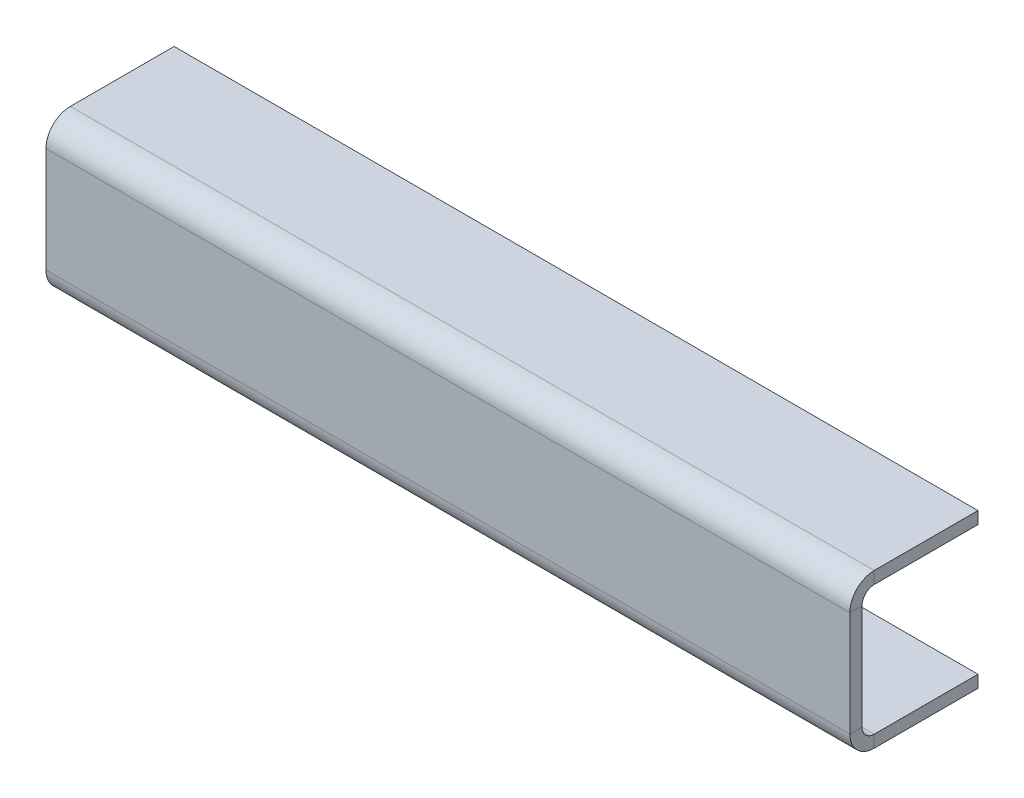
ISO-10303-21;
HEADER;
FILE_DESCRIPTION(('STEP AP214'),'2;1');
FILE_NAME('part.step','',(''),(''),'','','');
FILE_SCHEMA(('AUTOMOTIVE_DESIGN { 1 0 10303 214 1 1 1 1 }'));
ENDSEC;
DATA;
#1=APPLICATION_CONTEXT('core data for automotive mechanical design processes');
#2=APPLICATION_PROTOCOL_DEFINITION('international standard','automotive_design',2000,#1);
#3=PRODUCT_CONTEXT('',#1,'mechanical');
#4=PRODUCT('Part','Part','',(#3));
#5=PRODUCT_RELATED_PRODUCT_CATEGORY('part','',(#4));
#6=PRODUCT_DEFINITION_FORMATION('','',#4);
#7=PRODUCT_DEFINITION_CONTEXT('part definition',#1,'design');
#8=PRODUCT_DEFINITION('design','',#6,#7);
#9=PRODUCT_DEFINITION_SHAPE('','',#8);
#10=(LENGTH_UNIT() NAMED_UNIT(*) SI_UNIT(.MILLI.,.METRE.));
#11=(NAMED_UNIT(*) PLANE_ANGLE_UNIT() SI_UNIT($,.RADIAN.));
#12=(NAMED_UNIT(*) SI_UNIT($,.STERADIAN.) SOLID_ANGLE_UNIT());
#13=UNCERTAINTY_MEASURE_WITH_UNIT(LENGTH_MEASURE(1.E-05),#10,'distance_accuracy_value','');
#14=(GEOMETRIC_REPRESENTATION_CONTEXT(3) GLOBAL_UNCERTAINTY_ASSIGNED_CONTEXT((#13)) GLOBAL_UNIT_ASSIGNED_CONTEXT((#10,
#11,#12)) REPRESENTATION_CONTEXT('',''));
#15=CARTESIAN_POINT('',(0.,0.,0.));
#16=DIRECTION('',(0.,0.,1.));
#17=DIRECTION('',(1.,0.,0.));
#18=AXIS2_PLACEMENT_3D('',#15,#16,#17);
#19=CARTESIAN_POINT('',(209.55,0.,-3.175));
#20=DIRECTION('',(1.,0.,0.));
#21=DIRECTION('',(0.,0.,-1.));
#22=AXIS2_PLACEMENT_3D('',#19,#20,#21);
#23=PLANE('',#22);
#24=DIRECTION('',(0.,-1.,0.));
#25=VECTOR('',#24,1.);
#26=CARTESIAN_POINT('',(209.55,0.,-3.175));
#27=LINE('',#26,#25);
#28=CARTESIAN_POINT('',(209.55,0.,-3.175));
#29=VERTEX_POINT('',#28);
#30=CARTESIAN_POINT('',(209.55,-3.175,-3.175));
#31=VERTEX_POINT('',#30);
#32=EDGE_CURVE('E11',#29,#31,#27,.T.);
#33=ORIENTED_EDGE('',*,*,#32,.F.);
#34=CARTESIAN_POINT('',(209.55,3.175,-3.175));
#35=DIRECTION('',(1.,0.,0.));
#36=DIRECTION('',(0.,0.,-1.));
#37=AXIS2_PLACEMENT_3D('',#34,#35,#36);
#38=CIRCLE('',#37,3.175);
#39=CARTESIAN_POINT('',(209.55,3.175,0.));
#40=VERTEX_POINT('',#39);
#41=EDGE_CURVE('E145',#29,#40,#38,.F.);
#42=ORIENTED_EDGE('',*,*,#41,.T.);
#43=DIRECTION('',(0.,0.,-1.));
#44=VECTOR('',#43,1.);
#45=CARTESIAN_POINT('',(209.55,3.175,3.175));
#46=LINE('',#45,#44);
#47=CARTESIAN_POINT('',(209.55,3.175,3.175));
#48=VERTEX_POINT('',#47);
#49=EDGE_CURVE('E43',#48,#40,#46,.T.);
#50=ORIENTED_EDGE('',*,*,#49,.F.);
#51=CARTESIAN_POINT('',(209.55,3.175,-3.175));
#52=DIRECTION('',(1.,0.,0.));
#53=DIRECTION('',(0.,0.,-1.));
#54=AXIS2_PLACEMENT_3D('',#51,#52,#53);
#55=CIRCLE('',#54,6.35);
#56=EDGE_CURVE('E239',#31,#48,#55,.F.);
#57=ORIENTED_EDGE('',*,*,#56,.F.);
#58=EDGE_LOOP('',(#33,#42,#50,#57));
#59=FACE_BOUND('',#58,.T.);
#60=ADVANCED_FACE('F35',(#59),#23,.T.);
#61=CARTESIAN_POINT('',(209.55,3.175,3.175));
#62=DIRECTION('',(1.,0.,0.));
#63=DIRECTION('',(0.,0.,-1.));
#64=AXIS2_PLACEMENT_3D('',#61,#62,#63);
#65=PLANE('',#64);
#66=DIRECTION('',(0.,0.,1.));
#67=VECTOR('',#66,1.);
#68=CARTESIAN_POINT('',(209.55,0.,0.));
#69=LINE('',#68,#67);
#70=CARTESIAN_POINT('',(209.55,0.,-30.226));
#71=VERTEX_POINT('',#70);
#72=EDGE_CURVE('E150',#71,#29,#69,.T.);
#73=ORIENTED_EDGE('',*,*,#72,.T.);
#74=ORIENTED_EDGE('',*,*,#32,.T.);
#75=DIRECTION('',(0.,0.,-1.));
#76=VECTOR('',#75,1.);
#77=CARTESIAN_POINT('',(209.55,-3.175,0.));
#78=LINE('',#77,#76);
#79=CARTESIAN_POINT('',(209.55,-3.175,-30.226));
#80=VERTEX_POINT('',#79);
#81=EDGE_CURVE('E252',#80,#31,#78,.F.);
#82=ORIENTED_EDGE('',*,*,#81,.F.);
#83=DIRECTION('',(0.,-1.,0.));
#84=VECTOR('',#83,1.);
#85=CARTESIAN_POINT('',(209.55,0.,-30.226));
#86=LINE('',#85,#84);
#87=EDGE_CURVE('E254',#71,#80,#86,.T.);
#88=ORIENTED_EDGE('',*,*,#87,.F.);
#89=EDGE_LOOP('',(#73,#74,#82,#88));
#90=FACE_BOUND('',#89,.T.);
#91=ADVANCED_FACE('F265',(#90),#65,.T.);
#92=CARTESIAN_POINT('',(0.,3.175,0.));
#93=DIRECTION('',(-1.,0.,0.));
#94=DIRECTION('',(0.,0.,1.));
#95=AXIS2_PLACEMENT_3D('',#92,#93,#94);
#96=PLANE('',#95);
#97=DIRECTION('',(0.,0.,1.));
#98=VECTOR('',#97,1.);
#99=CARTESIAN_POINT('',(0.,3.175,0.));
#100=LINE('',#99,#98);
#101=CARTESIAN_POINT('',(0.,3.175,0.));
#102=VERTEX_POINT('',#101);
#103=CARTESIAN_POINT('',(0.,3.175,3.175));
#104=VERTEX_POINT('',#103);
#105=EDGE_CURVE('E143',#102,#104,#100,.T.);
#106=ORIENTED_EDGE('',*,*,#105,.F.);
#107=CARTESIAN_POINT('',(0.,3.175,-3.175));
#108=DIRECTION('',(1.,0.,0.));
#109=DIRECTION('',(0.,0.,-1.));
#110=AXIS2_PLACEMENT_3D('',#107,#108,#109);
#111=CIRCLE('',#110,3.175);
#112=CARTESIAN_POINT('',(0.,0.,-3.175));
#113=VERTEX_POINT('',#112);
#114=EDGE_CURVE('E157',#113,#102,#111,.F.);
#115=ORIENTED_EDGE('',*,*,#114,.F.);
#116=DIRECTION('',(0.,1.,0.));
#117=VECTOR('',#116,1.);
#118=CARTESIAN_POINT('',(0.,-3.175,-3.175));
#119=LINE('',#118,#117);
#120=CARTESIAN_POINT('',(0.,-3.175,-3.175));
#121=VERTEX_POINT('',#120);
#122=EDGE_CURVE('E230',#121,#113,#119,.T.);
#123=ORIENTED_EDGE('',*,*,#122,.F.);
#124=CARTESIAN_POINT('',(0.,3.175,-3.175));
#125=DIRECTION('',(1.,0.,0.));
#126=DIRECTION('',(0.,0.,-1.));
#127=AXIS2_PLACEMENT_3D('',#124,#125,#126);
#128=CIRCLE('',#127,6.35);
#129=EDGE_CURVE('E184',#121,#104,#128,.F.);
#130=ORIENTED_EDGE('',*,*,#129,.T.);
#131=EDGE_LOOP('',(#106,#115,#123,#130));
#132=FACE_BOUND('',#131,.T.);
#133=ADVANCED_FACE('F244',(#132),#96,.T.);
#134=CARTESIAN_POINT('',(0.,-3.175,-3.175));
#135=DIRECTION('',(-1.,0.,0.));
#136=DIRECTION('',(0.,0.,1.));
#137=AXIS2_PLACEMENT_3D('',#134,#135,#136);
#138=PLANE('',#137);
#139=DIRECTION('',(0.,1.,0.));
#140=VECTOR('',#139,1.);
#141=CARTESIAN_POINT('',(0.,0.,0.));
#142=LINE('',#141,#140);
#143=CARTESIAN_POINT('',(0.,30.607,0.));
#144=VERTEX_POINT('',#143);
#145=EDGE_CURVE('E197',#102,#144,#142,.T.);
#146=ORIENTED_EDGE('',*,*,#145,.F.);
#147=ORIENTED_EDGE('',*,*,#105,.T.);
#148=DIRECTION('',(0.,1.,0.));
#149=VECTOR('',#148,1.);
#150=CARTESIAN_POINT('',(0.,0.,3.175));
#151=LINE('',#150,#149);
#152=CARTESIAN_POINT('',(0.,30.607,3.175));
#153=VERTEX_POINT('',#152);
#154=EDGE_CURVE('E182',#104,#153,#151,.T.);
#155=ORIENTED_EDGE('',*,*,#154,.T.);
#156=DIRECTION('',(0.,0.,-1.));
#157=VECTOR('',#156,1.);
#158=CARTESIAN_POINT('',(0.,30.607,3.175));
#159=LINE('',#158,#157);
#160=EDGE_CURVE('E92',#153,#144,#159,.T.);
#161=ORIENTED_EDGE('',*,*,#160,.T.);
#162=EDGE_LOOP('',(#146,#147,#155,#161));
#163=FACE_BOUND('',#162,.T.);
#164=ADVANCED_FACE('F232',(#163),#138,.T.);
#165=CARTESIAN_POINT('',(209.55,30.607,0.));
#166=DIRECTION('',(1.,0.,0.));
#167=DIRECTION('',(0.,0.,-1.));
#168=AXIS2_PLACEMENT_3D('',#165,#166,#167);
#169=PLANE('',#168);
#170=DIRECTION('',(0.,0.,1.));
#171=VECTOR('',#170,1.);
#172=CARTESIAN_POINT('',(209.55,30.607,0.));
#173=LINE('',#172,#171);
#174=CARTESIAN_POINT('',(209.55,30.607,0.));
#175=VERTEX_POINT('',#174);
#176=CARTESIAN_POINT('',(209.55,30.607,3.175));
#177=VERTEX_POINT('',#176);
#178=EDGE_CURVE('E228',#175,#177,#173,.T.);
#179=ORIENTED_EDGE('',*,*,#178,.F.);
#180=CARTESIAN_POINT('',(209.55,30.607,-3.175));
#181=DIRECTION('',(1.,0.,0.));
#182=DIRECTION('',(0.,0.,-1.));
#183=AXIS2_PLACEMENT_3D('',#180,#181,#182);
#184=CIRCLE('',#183,3.175);
#185=CARTESIAN_POINT('',(209.55,33.782,-3.175));
#186=VERTEX_POINT('',#185);
#187=EDGE_CURVE('E165',#175,#186,#184,.F.);
#188=ORIENTED_EDGE('',*,*,#187,.T.);
#189=DIRECTION('',(0.,-1.,0.));
#190=VECTOR('',#189,1.);
#191=CARTESIAN_POINT('',(209.55,36.957,-3.175));
#192=LINE('',#191,#190);
#193=CARTESIAN_POINT('',(209.55,36.957,-3.175));
#194=VERTEX_POINT('',#193);
#195=EDGE_CURVE('E51',#194,#186,#192,.T.);
#196=ORIENTED_EDGE('',*,*,#195,.F.);
#197=CARTESIAN_POINT('',(209.55,30.607,-3.175));
#198=DIRECTION('',(1.,0.,0.));
#199=DIRECTION('',(0.,0.,-1.));
#200=AXIS2_PLACEMENT_3D('',#197,#198,#199);
#201=CIRCLE('',#200,6.35);
#202=EDGE_CURVE('E256',#177,#194,#201,.F.);
#203=ORIENTED_EDGE('',*,*,#202,.F.);
#204=EDGE_LOOP('',(#179,#188,#196,#203));
#205=FACE_BOUND('',#204,.T.);
#206=ADVANCED_FACE('F291',(#205),#169,.T.);
#207=CARTESIAN_POINT('',(209.55,36.957,-3.175));
#208=DIRECTION('',(1.,0.,0.));
#209=DIRECTION('',(0.,0.,-1.));
#210=AXIS2_PLACEMENT_3D('',#207,#208,#209);
#211=PLANE('',#210);
#212=DIRECTION('',(0.,1.,0.));
#213=VECTOR('',#212,1.);
#214=CARTESIAN_POINT('',(209.55,0.,0.));
#215=LINE('',#214,#213);
#216=EDGE_CURVE('E135',#40,#175,#215,.T.);
#217=ORIENTED_EDGE('',*,*,#216,.T.);
#218=ORIENTED_EDGE('',*,*,#178,.T.);
#219=DIRECTION('',(0.,1.,0.));
#220=VECTOR('',#219,1.);
#221=CARTESIAN_POINT('',(209.55,0.,3.175));
#222=LINE('',#221,#220);
#223=EDGE_CURVE('E138',#48,#177,#222,.T.);
#224=ORIENTED_EDGE('',*,*,#223,.F.);
#225=ORIENTED_EDGE('',*,*,#49,.T.);
#226=EDGE_LOOP('',(#217,#218,#224,#225));
#227=FACE_BOUND('',#226,.T.);
#228=ADVANCED_FACE('F133',(#227),#211,.T.);
#229=CARTESIAN_POINT('',(0.,33.782,-3.175));
#230=DIRECTION('',(-1.,0.,0.));
#231=DIRECTION('',(0.,0.,1.));
#232=AXIS2_PLACEMENT_3D('',#229,#230,#231);
#233=PLANE('',#232);
#234=DIRECTION('',(0.,1.,0.));
#235=VECTOR('',#234,1.);
#236=CARTESIAN_POINT('',(0.,33.782,-3.175));
#237=LINE('',#236,#235);
#238=CARTESIAN_POINT('',(0.,33.782,-3.175));
#239=VERTEX_POINT('',#238);
#240=CARTESIAN_POINT('',(0.,36.957,-3.175));
#241=VERTEX_POINT('',#240);
#242=EDGE_CURVE('E99',#239,#241,#237,.T.);
#243=ORIENTED_EDGE('',*,*,#242,.F.);
#244=CARTESIAN_POINT('',(0.,30.607,-3.175));
#245=DIRECTION('',(1.,0.,0.));
#246=DIRECTION('',(0.,0.,-1.));
#247=AXIS2_PLACEMENT_3D('',#244,#245,#246);
#248=CIRCLE('',#247,3.175);
#249=EDGE_CURVE('E199',#144,#239,#248,.F.);
#250=ORIENTED_EDGE('',*,*,#249,.F.);
#251=ORIENTED_EDGE('',*,*,#160,.F.);
#252=CARTESIAN_POINT('',(0.,30.607,-3.175));
#253=DIRECTION('',(1.,0.,0.));
#254=DIRECTION('',(0.,0.,-1.));
#255=AXIS2_PLACEMENT_3D('',#252,#253,#254);
#256=CIRCLE('',#255,6.35);
#257=EDGE_CURVE('E180',#153,#241,#256,.F.);
#258=ORIENTED_EDGE('',*,*,#257,.T.);
#259=EDGE_LOOP('',(#243,#250,#251,#258));
#260=FACE_BOUND('',#259,.T.);
#261=ADVANCED_FACE('F297',(#260),#233,.T.);
#262=CARTESIAN_POINT('',(0.,30.607,3.175));
#263=DIRECTION('',(-1.,0.,0.));
#264=DIRECTION('',(0.,0.,1.));
#265=AXIS2_PLACEMENT_3D('',#262,#263,#264);
#266=PLANE('',#265);
#267=DIRECTION('',(0.,0.,-1.));
#268=VECTOR('',#267,1.);
#269=CARTESIAN_POINT('',(0.,33.782,0.));
#270=LINE('',#269,#268);
#271=CARTESIAN_POINT('',(0.,33.782,-30.226));
#272=VERTEX_POINT('',#271);
#273=EDGE_CURVE('E171',#239,#272,#270,.T.);
#274=ORIENTED_EDGE('',*,*,#273,.F.);
#275=ORIENTED_EDGE('',*,*,#242,.T.);
#276=DIRECTION('',(0.,0.,-1.));
#277=VECTOR('',#276,1.);
#278=CARTESIAN_POINT('',(0.,36.957,0.));
#279=LINE('',#278,#277);
#280=CARTESIAN_POINT('',(0.,36.957,-30.226));
#281=VERTEX_POINT('',#280);
#282=EDGE_CURVE('E177',#241,#281,#279,.T.);
#283=ORIENTED_EDGE('',*,*,#282,.T.);
#284=DIRECTION('',(0.,-1.,0.));
#285=VECTOR('',#284,1.);
#286=CARTESIAN_POINT('',(0.,36.957,-30.226));
#287=LINE('',#286,#285);
#288=EDGE_CURVE('E174',#281,#272,#287,.T.);
#289=ORIENTED_EDGE('',*,*,#288,.T.);
#290=EDGE_LOOP('',(#274,#275,#283,#289));
#291=FACE_BOUND('',#290,.T.);
#292=ADVANCED_FACE('F300',(#291),#266,.T.);
#293=CARTESIAN_POINT('',(209.55,33.782,0.));
#294=DIRECTION('',(0.,1.,0.));
#295=DIRECTION('',(0.,0.,1.));
#296=AXIS2_PLACEMENT_3D('',#293,#294,#295);
#297=PLANE('',#296);
#298=ORIENTED_EDGE('',*,*,#273,.T.);
#299=DIRECTION('',(-1.,0.,0.));
#300=VECTOR('',#299,1.);
#301=CARTESIAN_POINT('',(209.55,33.782,-30.226));
#302=LINE('',#301,#300);
#303=CARTESIAN_POINT('',(209.55,33.782,-30.226));
#304=VERTEX_POINT('',#303);
#305=EDGE_CURVE('E223',#304,#272,#302,.T.);
#306=ORIENTED_EDGE('',*,*,#305,.F.);
#307=DIRECTION('',(0.,0.,-1.));
#308=VECTOR('',#307,1.);
#309=CARTESIAN_POINT('',(209.55,33.782,0.));
#310=LINE('',#309,#308);
#311=EDGE_CURVE('E105',#186,#304,#310,.T.);
#312=ORIENTED_EDGE('',*,*,#311,.F.);
#313=DIRECTION('',(-1.,0.,0.));
#314=VECTOR('',#313,1.);
#315=CARTESIAN_POINT('',(209.55,33.782,-3.175));
#316=LINE('',#315,#314);
#317=EDGE_CURVE('E167',#186,#239,#316,.T.);
#318=ORIENTED_EDGE('',*,*,#317,.T.);
#319=EDGE_LOOP('',(#298,#306,#312,#318));
#320=FACE_BOUND('',#319,.T.);
#321=ADVANCED_FACE('F303',(#320),#297,.F.);
#322=CARTESIAN_POINT('',(209.55,36.957,-30.226));
#323=DIRECTION('',(0.,0.,-1.));
#324=DIRECTION('',(-1.,0.,0.));
#325=AXIS2_PLACEMENT_3D('',#322,#323,#324);
#326=PLANE('',#325);
#327=ORIENTED_EDGE('',*,*,#288,.F.);
#328=DIRECTION('',(-1.,0.,0.));
#329=VECTOR('',#328,1.);
#330=CARTESIAN_POINT('',(209.55,36.957,-30.226));
#331=LINE('',#330,#329);
#332=CARTESIAN_POINT('',(209.55,36.957,-30.226));
#333=VERTEX_POINT('',#332);
#334=EDGE_CURVE('E221',#333,#281,#331,.T.);
#335=ORIENTED_EDGE('',*,*,#334,.F.);
#336=DIRECTION('',(0.,-1.,0.));
#337=VECTOR('',#336,1.);
#338=CARTESIAN_POINT('',(209.55,36.957,-30.226));
#339=LINE('',#338,#337);
#340=EDGE_CURVE('E511',#333,#304,#339,.T.);
#341=ORIENTED_EDGE('',*,*,#340,.T.);
#342=ORIENTED_EDGE('',*,*,#305,.T.);
#343=EDGE_LOOP('',(#327,#335,#341,#342));
#344=FACE_BOUND('',#343,.T.);
#345=ADVANCED_FACE('F307',(#344),#326,.T.);
#346=CARTESIAN_POINT('',(209.55,36.957,0.));
#347=DIRECTION('',(0.,1.,0.));
#348=DIRECTION('',(0.,0.,1.));
#349=AXIS2_PLACEMENT_3D('',#346,#347,#348);
#350=PLANE('',#349);
#351=ORIENTED_EDGE('',*,*,#282,.F.);
#352=DIRECTION('',(-1.,0.,0.));
#353=VECTOR('',#352,1.);
#354=CARTESIAN_POINT('',(209.55,36.957,-3.175));
#355=LINE('',#354,#353);
#356=EDGE_CURVE('E218',#194,#241,#355,.T.);
#357=ORIENTED_EDGE('',*,*,#356,.F.);
#358=DIRECTION('',(0.,0.,-1.));
#359=VECTOR('',#358,1.);
#360=CARTESIAN_POINT('',(209.55,36.957,0.));
#361=LINE('',#360,#359);
#362=EDGE_CURVE('E513',#194,#333,#361,.T.);
#363=ORIENTED_EDGE('',*,*,#362,.T.);
#364=ORIENTED_EDGE('',*,*,#334,.T.);
#365=EDGE_LOOP('',(#351,#357,#363,#364));
#366=FACE_BOUND('',#365,.T.);
#367=ADVANCED_FACE('F311',(#366),#350,.T.);
#368=CARTESIAN_POINT('',(209.55,30.607,-3.175));
#369=DIRECTION('',(-1.,0.,0.));
#370=DIRECTION('',(0.,0.,1.));
#371=AXIS2_PLACEMENT_3D('',#368,#369,#370);
#372=CYLINDRICAL_SURFACE('',#371,6.35);
#373=ORIENTED_EDGE('',*,*,#257,.F.);
#374=DIRECTION('',(-1.,0.,0.));
#375=VECTOR('',#374,1.);
#376=CARTESIAN_POINT('',(209.55,30.607,3.175));
#377=LINE('',#376,#375);
#378=EDGE_CURVE('E215',#177,#153,#377,.T.);
#379=ORIENTED_EDGE('',*,*,#378,.F.);
#380=ORIENTED_EDGE('',*,*,#202,.T.);
#381=ORIENTED_EDGE('',*,*,#356,.T.);
#382=EDGE_LOOP('',(#373,#379,#380,#381));
#383=FACE_BOUND('',#382,.T.);
#384=ADVANCED_FACE('F315',(#383),#372,.T.);
#385=CARTESIAN_POINT('',(209.55,0.,3.175));
#386=DIRECTION('',(0.,0.,1.));
#387=DIRECTION('',(1.,0.,0.));
#388=AXIS2_PLACEMENT_3D('',#385,#386,#387);
#389=PLANE('',#388);
#390=ORIENTED_EDGE('',*,*,#154,.F.);
#391=DIRECTION('',(-1.,0.,0.));
#392=VECTOR('',#391,1.);
#393=CARTESIAN_POINT('',(209.55,3.175,3.175));
#394=LINE('',#393,#392);
#395=EDGE_CURVE('E212',#48,#104,#394,.T.);
#396=ORIENTED_EDGE('',*,*,#395,.F.);
#397=ORIENTED_EDGE('',*,*,#223,.T.);
#398=ORIENTED_EDGE('',*,*,#378,.T.);
#399=EDGE_LOOP('',(#390,#396,#397,#398));
#400=FACE_BOUND('',#399,.T.);
#401=ADVANCED_FACE('F241',(#400),#389,.T.);
#402=CARTESIAN_POINT('',(209.55,3.175,-3.175));
#403=DIRECTION('',(-1.,0.,0.));
#404=DIRECTION('',(0.,0.,1.));
#405=AXIS2_PLACEMENT_3D('',#402,#403,#404);
#406=CYLINDRICAL_SURFACE('',#405,6.35);
#407=ORIENTED_EDGE('',*,*,#129,.F.);
#408=DIRECTION('',(-1.,0.,0.));
#409=VECTOR('',#408,1.);
#410=CARTESIAN_POINT('',(209.55,-3.175,-3.175));
#411=LINE('',#410,#409);
#412=EDGE_CURVE('E209',#31,#121,#411,.T.);
#413=ORIENTED_EDGE('',*,*,#412,.F.);
#414=ORIENTED_EDGE('',*,*,#56,.T.);
#415=ORIENTED_EDGE('',*,*,#395,.T.);
#416=EDGE_LOOP('',(#407,#413,#414,#415));
#417=FACE_BOUND('',#416,.T.);
#418=ADVANCED_FACE('F237',(#417),#406,.T.);
#419=CARTESIAN_POINT('',(209.55,-3.175,0.));
#420=DIRECTION('',(0.,-1.,0.));
#421=DIRECTION('',(0.,0.,-1.));
#422=AXIS2_PLACEMENT_3D('',#419,#420,#421);
#423=PLANE('',#422);
#424=DIRECTION('',(0.,0.,-1.));
#425=VECTOR('',#424,1.);
#426=CARTESIAN_POINT('',(0.,-3.175,0.));
#427=LINE('',#426,#425);
#428=CARTESIAN_POINT('',(0.,-3.175,-30.226));
#429=VERTEX_POINT('',#428);
#430=EDGE_CURVE('E187',#429,#121,#427,.F.);
#431=ORIENTED_EDGE('',*,*,#430,.F.);
#432=DIRECTION('',(-1.,0.,0.));
#433=VECTOR('',#432,1.);
#434=CARTESIAN_POINT('',(209.55,-3.175,-30.226));
#435=LINE('',#434,#433);
#436=EDGE_CURVE('E207',#80,#429,#435,.T.);
#437=ORIENTED_EDGE('',*,*,#436,.F.);
#438=ORIENTED_EDGE('',*,*,#81,.T.);
#439=ORIENTED_EDGE('',*,*,#412,.T.);
#440=EDGE_LOOP('',(#431,#437,#438,#439));
#441=FACE_BOUND('',#440,.T.);
#442=ADVANCED_FACE('F250',(#441),#423,.T.);
#443=CARTESIAN_POINT('',(209.55,0.,-30.226));
#444=DIRECTION('',(0.,0.,-1.));
#445=DIRECTION('',(-1.,0.,0.));
#446=AXIS2_PLACEMENT_3D('',#443,#444,#445);
#447=PLANE('',#446);
#448=DIRECTION('',(0.,-1.,0.));
#449=VECTOR('',#448,1.);
#450=CARTESIAN_POINT('',(0.,0.,-30.226));
#451=LINE('',#450,#449);
#452=CARTESIAN_POINT('',(0.,0.,-30.226));
#453=VERTEX_POINT('',#452);
#454=EDGE_CURVE('E190',#453,#429,#451,.T.);
#455=ORIENTED_EDGE('',*,*,#454,.F.);
#456=DIRECTION('',(-1.,0.,0.));
#457=VECTOR('',#456,1.);
#458=CARTESIAN_POINT('',(209.55,0.,-30.226));
#459=LINE('',#458,#457);
#460=EDGE_CURVE('E205',#71,#453,#459,.T.);
#461=ORIENTED_EDGE('',*,*,#460,.F.);
#462=ORIENTED_EDGE('',*,*,#87,.T.);
#463=ORIENTED_EDGE('',*,*,#436,.T.);
#464=EDGE_LOOP('',(#455,#461,#462,#463));
#465=FACE_BOUND('',#464,.T.);
#466=ADVANCED_FACE('F271',(#465),#447,.T.);
#467=CARTESIAN_POINT('',(209.55,0.,0.));
#468=DIRECTION('',(0.,-1.,0.));
#469=DIRECTION('',(0.,0.,-1.));
#470=AXIS2_PLACEMENT_3D('',#467,#468,#469);
#471=PLANE('',#470);
#472=DIRECTION('',(0.,0.,1.));
#473=VECTOR('',#472,1.);
#474=CARTESIAN_POINT('',(0.,0.,0.));
#475=LINE('',#474,#473);
#476=EDGE_CURVE('E193',#453,#113,#475,.T.);
#477=ORIENTED_EDGE('',*,*,#476,.T.);
#478=DIRECTION('',(-1.,0.,0.));
#479=VECTOR('',#478,1.);
#480=CARTESIAN_POINT('',(209.55,0.,-3.175));
#481=LINE('',#480,#479);
#482=EDGE_CURVE('E159',#29,#113,#481,.T.);
#483=ORIENTED_EDGE('',*,*,#482,.F.);
#484=ORIENTED_EDGE('',*,*,#72,.F.);
#485=ORIENTED_EDGE('',*,*,#460,.T.);
#486=EDGE_LOOP('',(#477,#483,#484,#485));
#487=FACE_BOUND('',#486,.T.);
#488=ADVANCED_FACE('F267',(#487),#471,.F.);
#489=CARTESIAN_POINT('',(209.55,3.175,-3.175));
#490=DIRECTION('',(-1.,0.,0.));
#491=DIRECTION('',(0.,0.,1.));
#492=AXIS2_PLACEMENT_3D('',#489,#490,#491);
#493=CYLINDRICAL_SURFACE('',#492,3.175);
#494=ORIENTED_EDGE('',*,*,#114,.T.);
#495=DIRECTION('',(-1.,0.,0.));
#496=VECTOR('',#495,1.);
#497=CARTESIAN_POINT('',(209.55,3.175,0.));
#498=LINE('',#497,#496);
#499=EDGE_CURVE('E154',#40,#102,#498,.T.);
#500=ORIENTED_EDGE('',*,*,#499,.F.);
#501=ORIENTED_EDGE('',*,*,#41,.F.);
#502=ORIENTED_EDGE('',*,*,#482,.T.);
#503=EDGE_LOOP('',(#494,#500,#501,#502));
#504=FACE_BOUND('',#503,.T.);
#505=ADVANCED_FACE('F155',(#504),#493,.F.);
#506=CARTESIAN_POINT('',(209.55,0.,0.));
#507=DIRECTION('',(0.,0.,1.));
#508=DIRECTION('',(1.,0.,0.));
#509=AXIS2_PLACEMENT_3D('',#506,#507,#508);
#510=PLANE('',#509);
#511=ORIENTED_EDGE('',*,*,#145,.T.);
#512=DIRECTION('',(-1.,0.,0.));
#513=VECTOR('',#512,1.);
#514=CARTESIAN_POINT('',(209.55,30.607,0.));
#515=LINE('',#514,#513);
#516=EDGE_CURVE('E160',#175,#144,#515,.T.);
#517=ORIENTED_EDGE('',*,*,#516,.F.);
#518=ORIENTED_EDGE('',*,*,#216,.F.);
#519=ORIENTED_EDGE('',*,*,#499,.T.);
#520=EDGE_LOOP('',(#511,#517,#518,#519));
#521=FACE_BOUND('',#520,.T.);
#522=ADVANCED_FACE('F162',(#521),#510,.F.);
#523=CARTESIAN_POINT('',(209.55,30.607,-3.175));
#524=DIRECTION('',(-1.,0.,0.));
#525=DIRECTION('',(0.,0.,1.));
#526=AXIS2_PLACEMENT_3D('',#523,#524,#525);
#527=CYLINDRICAL_SURFACE('',#526,3.175);
#528=ORIENTED_EDGE('',*,*,#249,.T.);
#529=ORIENTED_EDGE('',*,*,#317,.F.);
#530=ORIENTED_EDGE('',*,*,#187,.F.);
#531=ORIENTED_EDGE('',*,*,#516,.T.);
#532=EDGE_LOOP('',(#528,#529,#530,#531));
#533=FACE_BOUND('',#532,.T.);
#534=ADVANCED_FACE('F362',(#533),#527,.F.);
#535=CARTESIAN_POINT('',(209.55,30.607,-3.175));
#536=DIRECTION('',(1.,0.,0.));
#537=DIRECTION('',(0.,0.,-1.));
#538=AXIS2_PLACEMENT_3D('',#535,#536,#537);
#539=PLANE('',#538);
#540=ORIENTED_EDGE('',*,*,#311,.T.);
#541=ORIENTED_EDGE('',*,*,#340,.F.);
#542=ORIENTED_EDGE('',*,*,#362,.F.);
#543=ORIENTED_EDGE('',*,*,#195,.T.);
#544=EDGE_LOOP('',(#540,#541,#542,#543));
#545=FACE_BOUND('',#544,.T.);
#546=ADVANCED_FACE('F372',(#545),#539,.T.);
#547=CARTESIAN_POINT('',(0.,30.607,-3.175));
#548=DIRECTION('',(1.,0.,0.));
#549=DIRECTION('',(0.,0.,-1.));
#550=AXIS2_PLACEMENT_3D('',#547,#548,#549);
#551=PLANE('',#550);
#552=ORIENTED_EDGE('',*,*,#430,.T.);
#553=ORIENTED_EDGE('',*,*,#122,.T.);
#554=ORIENTED_EDGE('',*,*,#476,.F.);
#555=ORIENTED_EDGE('',*,*,#454,.T.);
#556=EDGE_LOOP('',(#552,#553,#554,#555));
#557=FACE_BOUND('',#556,.T.);
#558=ADVANCED_FACE('F269',(#557),#551,.F.);
#559=CLOSED_SHELL('',(#60,#91,#133,#164,#206,#228,#261,#292,#321,#345,#367,#384,#401,#418,#442,
#466,#488,#505,#522,#534,#546,#558));
#560=MANIFOLD_SOLID_BREP('B2',#559);
#561=ADVANCED_BREP_SHAPE_REPRESENTATION('',(#18,#560),#14);
#562=SHAPE_DEFINITION_REPRESENTATION(#9,#561);
ENDSEC;
END-ISO-10303-21;
